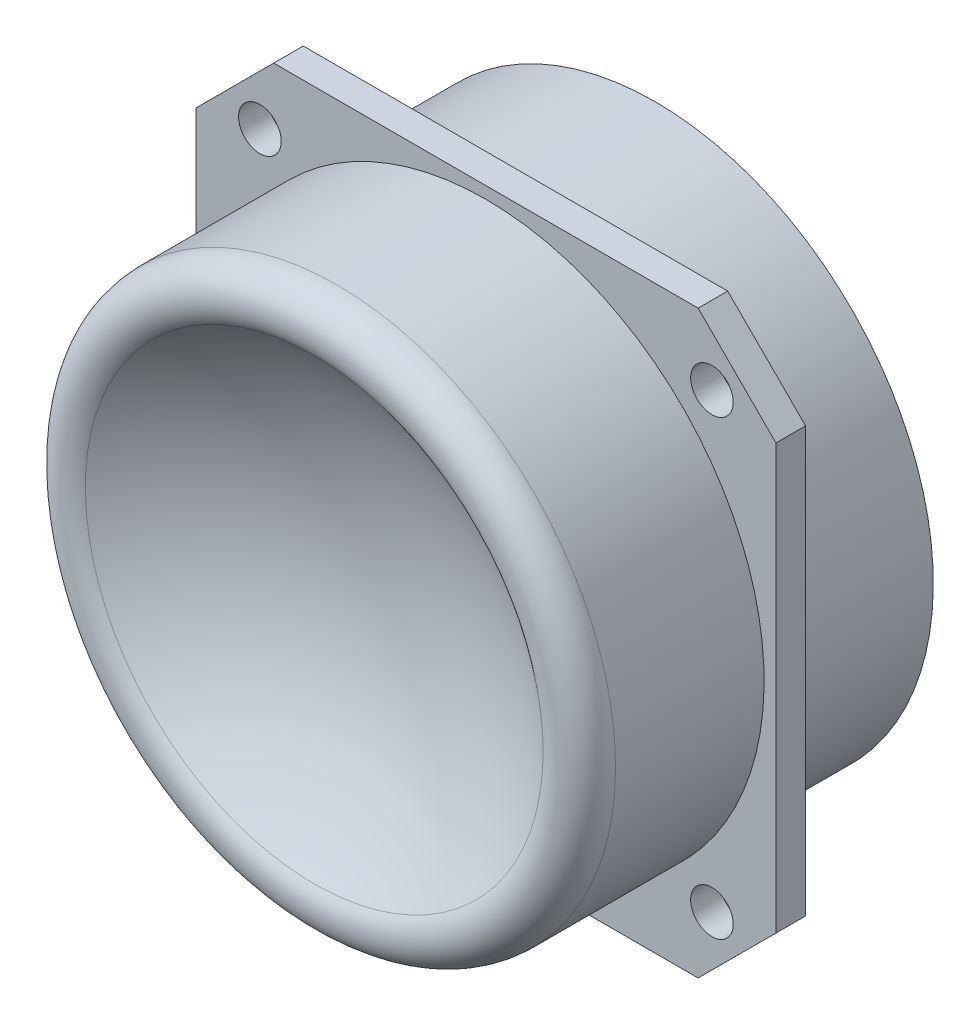
ISO-10303-21;
HEADER;
FILE_DESCRIPTION(('STEP AP214'),'2;1');
FILE_NAME('part.step','',(''),(''),'','','');
FILE_SCHEMA(('AUTOMOTIVE_DESIGN { 1 0 10303 214 1 1 1 1 }'));
ENDSEC;
DATA;
#1=APPLICATION_CONTEXT('core data for automotive mechanical design processes');
#2=APPLICATION_PROTOCOL_DEFINITION('international standard','automotive_design',2000,#1);
#3=PRODUCT_CONTEXT('',#1,'mechanical');
#4=PRODUCT('Part','Part','',(#3));
#5=PRODUCT_RELATED_PRODUCT_CATEGORY('part','',(#4));
#6=PRODUCT_DEFINITION_FORMATION('','',#4);
#7=PRODUCT_DEFINITION_CONTEXT('part definition',#1,'design');
#8=PRODUCT_DEFINITION('design','',#6,#7);
#9=PRODUCT_DEFINITION_SHAPE('','',#8);
#10=(LENGTH_UNIT() NAMED_UNIT(*) SI_UNIT(.MILLI.,.METRE.));
#11=(NAMED_UNIT(*) PLANE_ANGLE_UNIT() SI_UNIT($,.RADIAN.));
#12=(NAMED_UNIT(*) SI_UNIT($,.STERADIAN.) SOLID_ANGLE_UNIT());
#13=UNCERTAINTY_MEASURE_WITH_UNIT(LENGTH_MEASURE(1.E-05),#10,'distance_accuracy_value','');
#14=(GEOMETRIC_REPRESENTATION_CONTEXT(3) GLOBAL_UNCERTAINTY_ASSIGNED_CONTEXT((#13)) GLOBAL_UNIT_ASSIGNED_CONTEXT((#10,
#11,#12)) REPRESENTATION_CONTEXT('',''));
#15=CARTESIAN_POINT('',(0.,0.,0.));
#16=DIRECTION('',(0.,0.,1.));
#17=DIRECTION('',(1.,0.,0.));
#18=AXIS2_PLACEMENT_3D('',#15,#16,#17);
#19=CARTESIAN_POINT('',(24.5,-24.5,-2.5));
#20=DIRECTION('',(1.,0.,0.));
#21=DIRECTION('',(0.,0.,-1.));
#22=AXIS2_PLACEMENT_3D('',#19,#20,#21);
#23=PLANE('',#22);
#24=DIRECTION('',(0.,0.,1.));
#25=VECTOR('',#24,1.);
#26=CARTESIAN_POINT('',(24.5,-17.9264068711928,-2.5));
#27=LINE('',#26,#25);
#28=CARTESIAN_POINT('',(24.5,-17.9264068711928,-2.5));
#29=VERTEX_POINT('',#28);
#30=CARTESIAN_POINT('',(24.5,-17.9264068711928,0.));
#31=VERTEX_POINT('',#30);
#32=EDGE_CURVE('E157',#29,#31,#27,.T.);
#33=ORIENTED_EDGE('',*,*,#32,.F.);
#34=DIRECTION('',(0.,1.,0.));
#35=VECTOR('',#34,1.);
#36=CARTESIAN_POINT('',(24.5,-24.5,-2.5));
#37=LINE('',#36,#35);
#38=CARTESIAN_POINT('',(24.5,17.9264068711928,-2.5));
#39=VERTEX_POINT('',#38);
#40=EDGE_CURVE('E127',#29,#39,#37,.T.);
#41=ORIENTED_EDGE('',*,*,#40,.T.);
#42=DIRECTION('',(0.,0.,1.));
#43=VECTOR('',#42,1.);
#44=CARTESIAN_POINT('',(24.5,17.9264068711928,-2.5));
#45=LINE('',#44,#43);
#46=CARTESIAN_POINT('',(24.5,17.9264068711928,0.));
#47=VERTEX_POINT('',#46);
#48=EDGE_CURVE('E104',#39,#47,#45,.T.);
#49=ORIENTED_EDGE('',*,*,#48,.T.);
#50=DIRECTION('',(0.,1.,0.));
#51=VECTOR('',#50,1.);
#52=CARTESIAN_POINT('',(24.5,-24.5,0.));
#53=LINE('',#52,#51);
#54=EDGE_CURVE('E136',#31,#47,#53,.T.);
#55=ORIENTED_EDGE('',*,*,#54,.F.);
#56=EDGE_LOOP('',(#33,#41,#49,#55));
#57=FACE_BOUND('',#56,.T.);
#58=ADVANCED_FACE('F33',(#57),#23,.T.);
#59=CARTESIAN_POINT('',(-24.5,-24.5,-2.5));
#60=DIRECTION('',(0.,-1.,0.));
#61=DIRECTION('',(0.,0.,-1.));
#62=AXIS2_PLACEMENT_3D('',#59,#60,#61);
#63=PLANE('',#62);
#64=DIRECTION('',(0.,0.,1.));
#65=VECTOR('',#64,1.);
#66=CARTESIAN_POINT('',(-17.9264068711928,-24.5,-2.5));
#67=LINE('',#66,#65);
#68=CARTESIAN_POINT('',(-17.9264068711928,-24.5,-2.5));
#69=VERTEX_POINT('',#68);
#70=CARTESIAN_POINT('',(-17.9264068711928,-24.5,0.));
#71=VERTEX_POINT('',#70);
#72=EDGE_CURVE('E49',#69,#71,#67,.T.);
#73=ORIENTED_EDGE('',*,*,#72,.F.);
#74=DIRECTION('',(1.,0.,0.));
#75=VECTOR('',#74,1.);
#76=CARTESIAN_POINT('',(-24.5,-24.5,-2.5));
#77=LINE('',#76,#75);
#78=CARTESIAN_POINT('',(17.9264068711928,-24.5,-2.5));
#79=VERTEX_POINT('',#78);
#80=EDGE_CURVE('E41',#69,#79,#77,.T.);
#81=ORIENTED_EDGE('',*,*,#80,.T.);
#82=DIRECTION('',(0.,0.,1.));
#83=VECTOR('',#82,1.);
#84=CARTESIAN_POINT('',(17.9264068711928,-24.5,-2.5));
#85=LINE('',#84,#83);
#86=CARTESIAN_POINT('',(17.9264068711928,-24.5,0.));
#87=VERTEX_POINT('',#86);
#88=EDGE_CURVE('E154',#79,#87,#85,.T.);
#89=ORIENTED_EDGE('',*,*,#88,.T.);
#90=DIRECTION('',(1.,0.,0.));
#91=VECTOR('',#90,1.);
#92=CARTESIAN_POINT('',(-24.5,-24.5,0.));
#93=LINE('',#92,#91);
#94=EDGE_CURVE('E131',#71,#87,#93,.T.);
#95=ORIENTED_EDGE('',*,*,#94,.F.);
#96=EDGE_LOOP('',(#73,#81,#89,#95));
#97=FACE_BOUND('',#96,.T.);
#98=ADVANCED_FACE('F152',(#97),#63,.T.);
#99=CARTESIAN_POINT('',(-24.5,-24.5,-2.5));
#100=DIRECTION('',(-1.,0.,0.));
#101=DIRECTION('',(0.,0.,1.));
#102=AXIS2_PLACEMENT_3D('',#99,#100,#101);
#103=PLANE('',#102);
#104=DIRECTION('',(0.,0.,1.));
#105=VECTOR('',#104,1.);
#106=CARTESIAN_POINT('',(-24.5,-17.9264068711928,-2.5));
#107=LINE('',#106,#105);
#108=CARTESIAN_POINT('',(-24.5,-17.9264068711928,-2.5));
#109=VERTEX_POINT('',#108);
#110=CARTESIAN_POINT('',(-24.5,-17.9264068711928,0.));
#111=VERTEX_POINT('',#110);
#112=EDGE_CURVE('E167',#109,#111,#107,.T.);
#113=ORIENTED_EDGE('',*,*,#112,.T.);
#114=DIRECTION('',(0.,-1.,0.));
#115=VECTOR('',#114,1.);
#116=CARTESIAN_POINT('',(-24.5,-24.5,0.));
#117=LINE('',#116,#115);
#118=CARTESIAN_POINT('',(-24.5,17.9264068711929,0.));
#119=VERTEX_POINT('',#118);
#120=EDGE_CURVE('E140',#119,#111,#117,.T.);
#121=ORIENTED_EDGE('',*,*,#120,.F.);
#122=DIRECTION('',(0.,0.,1.));
#123=VECTOR('',#122,1.);
#124=CARTESIAN_POINT('',(-24.5,17.9264068711929,-2.5));
#125=LINE('',#124,#123);
#126=CARTESIAN_POINT('',(-24.5,17.9264068711929,-2.5));
#127=VERTEX_POINT('',#126);
#128=EDGE_CURVE('E57',#127,#119,#125,.T.);
#129=ORIENTED_EDGE('',*,*,#128,.F.);
#130=DIRECTION('',(0.,-1.,0.));
#131=VECTOR('',#130,1.);
#132=CARTESIAN_POINT('',(-24.5,-24.5,-2.5));
#133=LINE('',#132,#131);
#134=EDGE_CURVE('E126',#127,#109,#133,.T.);
#135=ORIENTED_EDGE('',*,*,#134,.T.);
#136=EDGE_LOOP('',(#113,#121,#129,#135));
#137=FACE_BOUND('',#136,.T.);
#138=ADVANCED_FACE('F215',(#137),#103,.T.);
#139=CARTESIAN_POINT('',(-24.5,24.5,-2.5));
#140=DIRECTION('',(0.,1.,0.));
#141=DIRECTION('',(0.,0.,1.));
#142=AXIS2_PLACEMENT_3D('',#139,#140,#141);
#143=PLANE('',#142);
#144=DIRECTION('',(0.,0.,1.));
#145=VECTOR('',#144,1.);
#146=CARTESIAN_POINT('',(17.9264068711928,24.5,-2.5));
#147=LINE('',#146,#145);
#148=CARTESIAN_POINT('',(17.9264068711928,24.5,-2.5));
#149=VERTEX_POINT('',#148);
#150=CARTESIAN_POINT('',(17.9264068711928,24.5,0.));
#151=VERTEX_POINT('',#150);
#152=EDGE_CURVE('E101',#149,#151,#147,.T.);
#153=ORIENTED_EDGE('',*,*,#152,.F.);
#154=DIRECTION('',(-1.,0.,0.));
#155=VECTOR('',#154,1.);
#156=CARTESIAN_POINT('',(-24.5,24.5,-2.5));
#157=LINE('',#156,#155);
#158=CARTESIAN_POINT('',(-17.9264068711928,24.5,-2.5));
#159=VERTEX_POINT('',#158);
#160=EDGE_CURVE('E116',#149,#159,#157,.T.);
#161=ORIENTED_EDGE('',*,*,#160,.T.);
#162=DIRECTION('',(0.,0.,1.));
#163=VECTOR('',#162,1.);
#164=CARTESIAN_POINT('',(-17.9264068711928,24.5,-2.5));
#165=LINE('',#164,#163);
#166=CARTESIAN_POINT('',(-17.9264068711928,24.5,0.));
#167=VERTEX_POINT('',#166);
#168=EDGE_CURVE('E176',#159,#167,#165,.T.);
#169=ORIENTED_EDGE('',*,*,#168,.T.);
#170=DIRECTION('',(-1.,0.,0.));
#171=VECTOR('',#170,1.);
#172=CARTESIAN_POINT('',(-24.5,24.5,0.));
#173=LINE('',#172,#171);
#174=EDGE_CURVE('E118',#151,#167,#173,.T.);
#175=ORIENTED_EDGE('',*,*,#174,.F.);
#176=EDGE_LOOP('',(#153,#161,#169,#175));
#177=FACE_BOUND('',#176,.T.);
#178=ADVANCED_FACE('F114',(#177),#143,.T.);
#179=CARTESIAN_POINT('',(0.,0.,-2.5));
#180=DIRECTION('',(0.,0.,-1.));
#181=DIRECTION('',(-1.,0.,0.));
#182=AXIS2_PLACEMENT_3D('',#179,#180,#181);
#183=PLANE('',#182);
#184=CARTESIAN_POINT('',(-19.0918830920368,19.0918830920368,-2.5));
#185=DIRECTION('',(0.,0.,-1.));
#186=DIRECTION('',(-1.,0.,0.));
#187=AXIS2_PLACEMENT_3D('',#184,#185,#186);
#188=CIRCLE('',#187,1.8);
#189=CARTESIAN_POINT('',(-20.8918830920368,19.0918830920368,-2.5));
#190=VERTEX_POINT('',#189);
#191=EDGE_CURVE('E237',#190,#190,#188,.T.);
#192=ORIENTED_EDGE('',*,*,#191,.F.);
#193=EDGE_LOOP('',(#192));
#194=FACE_BOUND('',#193,.T.);
#195=CARTESIAN_POINT('',(19.0918830920368,-19.0918830920368,-2.5));
#196=DIRECTION('',(0.,0.,-1.));
#197=DIRECTION('',(-1.,0.,0.));
#198=AXIS2_PLACEMENT_3D('',#195,#196,#197);
#199=CIRCLE('',#198,1.8);
#200=CARTESIAN_POINT('',(17.2918830920368,-19.0918830920368,-2.5));
#201=VERTEX_POINT('',#200);
#202=EDGE_CURVE('E231',#201,#201,#199,.T.);
#203=ORIENTED_EDGE('',*,*,#202,.F.);
#204=EDGE_LOOP('',(#203));
#205=FACE_BOUND('',#204,.T.);
#206=CARTESIAN_POINT('',(-19.0918830920368,-19.0918830920368,-2.5));
#207=DIRECTION('',(0.,0.,-1.));
#208=DIRECTION('',(-1.,0.,0.));
#209=AXIS2_PLACEMENT_3D('',#206,#207,#208);
#210=CIRCLE('',#209,1.8);
#211=CARTESIAN_POINT('',(-20.8918830920368,-19.0918830920368,-2.5));
#212=VERTEX_POINT('',#211);
#213=EDGE_CURVE('E225',#212,#212,#210,.T.);
#214=ORIENTED_EDGE('',*,*,#213,.F.);
#215=EDGE_LOOP('',(#214));
#216=FACE_BOUND('',#215,.T.);
#217=CARTESIAN_POINT('',(19.0918830920368,19.0918830920368,-2.5));
#218=DIRECTION('',(0.,0.,-1.));
#219=DIRECTION('',(-1.,0.,0.));
#220=AXIS2_PLACEMENT_3D('',#217,#218,#219);
#221=CIRCLE('',#220,1.8);
#222=CARTESIAN_POINT('',(17.2918830920368,19.0918830920368,-2.5));
#223=VERTEX_POINT('',#222);
#224=EDGE_CURVE('E169',#223,#223,#221,.T.);
#225=ORIENTED_EDGE('',*,*,#224,.F.);
#226=EDGE_LOOP('',(#225));
#227=FACE_BOUND('',#226,.T.);
#228=DIRECTION('',(-0.707106781186547,0.707106781186548,0.));
#229=VECTOR('',#228,1.);
#230=CARTESIAN_POINT('',(-24.5,-17.9264068711928,-2.5));
#231=LINE('',#230,#229);
#232=EDGE_CURVE('E165',#69,#109,#231,.T.);
#233=ORIENTED_EDGE('',*,*,#232,.T.);
#234=ORIENTED_EDGE('',*,*,#134,.F.);
#235=DIRECTION('',(0.707106781186548,0.707106781186547,0.));
#236=VECTOR('',#235,1.);
#237=CARTESIAN_POINT('',(-24.5,17.9264068711929,-2.5));
#238=LINE('',#237,#236);
#239=EDGE_CURVE('E125',#127,#159,#238,.T.);
#240=ORIENTED_EDGE('',*,*,#239,.T.);
#241=ORIENTED_EDGE('',*,*,#160,.F.);
#242=DIRECTION('',(0.707106781186548,-0.707106781186548,0.));
#243=VECTOR('',#242,1.);
#244=CARTESIAN_POINT('',(24.5,17.9264068711928,-2.5));
#245=LINE('',#244,#243);
#246=EDGE_CURVE('E98',#149,#39,#245,.T.);
#247=ORIENTED_EDGE('',*,*,#246,.T.);
#248=ORIENTED_EDGE('',*,*,#40,.F.);
#249=DIRECTION('',(-0.707106781186547,-0.707106781186548,0.));
#250=VECTOR('',#249,1.);
#251=CARTESIAN_POINT('',(24.5,-17.9264068711928,-2.5));
#252=LINE('',#251,#250);
#253=EDGE_CURVE('E160',#29,#79,#252,.T.);
#254=ORIENTED_EDGE('',*,*,#253,.T.);
#255=ORIENTED_EDGE('',*,*,#80,.F.);
#256=EDGE_LOOP('',(#233,#234,#240,#241,#247,#248,#254,#255));
#257=FACE_BOUND('',#256,.T.);
#258=CARTESIAN_POINT('',(0.,0.,-2.5));
#259=DIRECTION('',(0.,0.,-1.));
#260=DIRECTION('',(-1.,0.,0.));
#261=AXIS2_PLACEMENT_3D('',#258,#259,#260);
#262=CIRCLE('',#261,23.5);
#263=CARTESIAN_POINT('',(-23.5,0.,-2.5));
#264=VERTEX_POINT('',#263);
#265=EDGE_CURVE('E11',#264,#264,#262,.T.);
#266=ORIENTED_EDGE('',*,*,#265,.F.);
#267=EDGE_LOOP('',(#266));
#268=FACE_BOUND('',#267,.T.);
#269=ADVANCED_FACE('F122',(#194,#205,#216,#227,#257,#268),#183,.T.);
#270=CARTESIAN_POINT('',(0.,0.,0.));
#271=DIRECTION('',(0.,0.,-1.));
#272=DIRECTION('',(-1.,0.,0.));
#273=AXIS2_PLACEMENT_3D('',#270,#271,#272);
#274=PLANE('',#273);
#275=CARTESIAN_POINT('',(-19.0918830920368,19.0918830920368,0.));
#276=DIRECTION('',(0.,0.,1.));
#277=DIRECTION('',(1.,0.,0.));
#278=AXIS2_PLACEMENT_3D('',#275,#276,#277);
#279=CIRCLE('',#278,1.8);
#280=CARTESIAN_POINT('',(-17.2918830920368,19.0918830920368,0.));
#281=VERTEX_POINT('',#280);
#282=EDGE_CURVE('E240',#281,#281,#279,.T.);
#283=ORIENTED_EDGE('',*,*,#282,.F.);
#284=EDGE_LOOP('',(#283));
#285=FACE_BOUND('',#284,.T.);
#286=CARTESIAN_POINT('',(19.0918830920368,-19.0918830920368,0.));
#287=DIRECTION('',(0.,0.,1.));
#288=DIRECTION('',(1.,0.,0.));
#289=AXIS2_PLACEMENT_3D('',#286,#287,#288);
#290=CIRCLE('',#289,1.8);
#291=CARTESIAN_POINT('',(20.8918830920368,-19.0918830920368,0.));
#292=VERTEX_POINT('',#291);
#293=EDGE_CURVE('E234',#292,#292,#290,.T.);
#294=ORIENTED_EDGE('',*,*,#293,.F.);
#295=EDGE_LOOP('',(#294));
#296=FACE_BOUND('',#295,.T.);
#297=CARTESIAN_POINT('',(-19.0918830920368,-19.0918830920368,0.));
#298=DIRECTION('',(0.,0.,1.));
#299=DIRECTION('',(1.,0.,0.));
#300=AXIS2_PLACEMENT_3D('',#297,#298,#299);
#301=CIRCLE('',#300,1.8);
#302=CARTESIAN_POINT('',(-17.2918830920368,-19.0918830920368,0.));
#303=VERTEX_POINT('',#302);
#304=EDGE_CURVE('E228',#303,#303,#301,.T.);
#305=ORIENTED_EDGE('',*,*,#304,.F.);
#306=EDGE_LOOP('',(#305));
#307=FACE_BOUND('',#306,.T.);
#308=CARTESIAN_POINT('',(19.0918830920368,19.0918830920368,0.));
#309=DIRECTION('',(0.,0.,1.));
#310=DIRECTION('',(1.,0.,0.));
#311=AXIS2_PLACEMENT_3D('',#308,#309,#310);
#312=CIRCLE('',#311,1.8);
#313=CARTESIAN_POINT('',(20.8918830920368,19.0918830920368,0.));
#314=VERTEX_POINT('',#313);
#315=EDGE_CURVE('E222',#314,#314,#312,.T.);
#316=ORIENTED_EDGE('',*,*,#315,.F.);
#317=EDGE_LOOP('',(#316));
#318=FACE_BOUND('',#317,.T.);
#319=CARTESIAN_POINT('',(0.,0.,0.));
#320=DIRECTION('',(0.,0.,-1.));
#321=DIRECTION('',(-1.,0.,0.));
#322=AXIS2_PLACEMENT_3D('',#319,#320,#321);
#323=CIRCLE('',#322,23.5);
#324=CARTESIAN_POINT('',(-23.5,0.,0.));
#325=VERTEX_POINT('',#324);
#326=EDGE_CURVE('E36',#325,#325,#323,.T.);
#327=ORIENTED_EDGE('',*,*,#326,.T.);
#328=EDGE_LOOP('',(#327));
#329=FACE_BOUND('',#328,.T.);
#330=ORIENTED_EDGE('',*,*,#120,.T.);
#331=DIRECTION('',(-0.707106781186547,0.707106781186548,0.));
#332=VECTOR('',#331,1.);
#333=CARTESIAN_POINT('',(-24.5,-17.9264068711928,0.));
#334=LINE('',#333,#332);
#335=EDGE_CURVE('E149',#71,#111,#334,.T.);
#336=ORIENTED_EDGE('',*,*,#335,.F.);
#337=ORIENTED_EDGE('',*,*,#94,.T.);
#338=DIRECTION('',(-0.707106781186547,-0.707106781186548,0.));
#339=VECTOR('',#338,1.);
#340=CARTESIAN_POINT('',(24.5,-17.9264068711928,0.));
#341=LINE('',#340,#339);
#342=EDGE_CURVE('E147',#31,#87,#341,.T.);
#343=ORIENTED_EDGE('',*,*,#342,.F.);
#344=ORIENTED_EDGE('',*,*,#54,.T.);
#345=DIRECTION('',(0.707106781186548,-0.707106781186548,0.));
#346=VECTOR('',#345,1.);
#347=CARTESIAN_POINT('',(24.5,17.9264068711928,0.));
#348=LINE('',#347,#346);
#349=EDGE_CURVE('E109',#151,#47,#348,.T.);
#350=ORIENTED_EDGE('',*,*,#349,.F.);
#351=ORIENTED_EDGE('',*,*,#174,.T.);
#352=DIRECTION('',(0.707106781186548,0.707106781186547,0.));
#353=VECTOR('',#352,1.);
#354=CARTESIAN_POINT('',(-24.5,17.9264068711929,0.));
#355=LINE('',#354,#353);
#356=EDGE_CURVE('E174',#119,#167,#355,.T.);
#357=ORIENTED_EDGE('',*,*,#356,.F.);
#358=EDGE_LOOP('',(#330,#336,#337,#343,#344,#350,#351,#357));
#359=FACE_BOUND('',#358,.T.);
#360=ADVANCED_FACE('F146',(#285,#296,#307,#318,#329,#359),#274,.F.);
#361=CARTESIAN_POINT('',(0.,0.,12.55));
#362=DIRECTION('',(0.,0.,-1.));
#363=DIRECTION('',(0.,1.,0.));
#364=AXIS2_PLACEMENT_3D('',#361,#362,#363);
#365=TOROIDAL_SURFACE('',#364,20.96,2.54);
#366=CARTESIAN_POINT('',(0.,0.,14.5012579938626));
#367=DIRECTION('',(0.,0.,-1.));
#368=DIRECTION('',(0.,1.,0.));
#369=AXIS2_PLACEMENT_3D('',#366,#367,#368);
#370=CIRCLE('',#369,19.3339027577087);
#371=CARTESIAN_POINT('',(0.,19.3339027577087,14.5012579938626));
#372=VERTEX_POINT('',#371);
#373=EDGE_CURVE('E185',#372,#372,#370,.T.);
#374=ORIENTED_EDGE('',*,*,#373,.T.);
#375=EDGE_LOOP('',(#374));
#376=FACE_BOUND('',#375,.T.);
#377=CARTESIAN_POINT('',(0.,0.,12.55));
#378=DIRECTION('',(0.,0.,-1.));
#379=DIRECTION('',(0.,1.,0.));
#380=AXIS2_PLACEMENT_3D('',#377,#378,#379);
#381=CIRCLE('',#380,23.5);
#382=CARTESIAN_POINT('',(0.,23.5,12.55));
#383=VERTEX_POINT('',#382);
#384=EDGE_CURVE('E182',#383,#383,#381,.T.);
#385=ORIENTED_EDGE('',*,*,#384,.F.);
#386=EDGE_LOOP('',(#385));
#387=FACE_BOUND('',#386,.T.);
#388=ADVANCED_FACE('F205',(#376,#387),#365,.T.);
#389=CARTESIAN_POINT('',(0.,0.,37.7012434113294));
#390=DIRECTION('',(0.,0.,-1.));
#391=DIRECTION('',(0.,1.,0.));
#392=AXIS2_PLACEMENT_3D('',#389,#390,#391);
#393=SPHERICAL_SURFACE('',#392,30.1999854174668);
#394=ORIENTED_EDGE('',*,*,#373,.F.);
#395=EDGE_LOOP('',(#394));
#396=FACE_BOUND('',#395,.T.);
#397=ADVANCED_FACE('F196',(#396),#393,.F.);
#398=CARTESIAN_POINT('',(0.,0.,0.));
#399=DIRECTION('',(0.,0.,-1.));
#400=DIRECTION('',(0.,1.,0.));
#401=AXIS2_PLACEMENT_3D('',#398,#399,#400);
#402=CYLINDRICAL_SURFACE('',#401,23.5);
#403=ORIENTED_EDGE('',*,*,#384,.T.);
#404=EDGE_LOOP('',(#403));
#405=FACE_BOUND('',#404,.T.);
#406=ORIENTED_EDGE('',*,*,#326,.F.);
#407=EDGE_LOOP('',(#406));
#408=FACE_BOUND('',#407,.T.);
#409=ADVANCED_FACE('F193',(#405,#408),#402,.T.);
#410=ORIENTED_EDGE('',*,*,#265,.T.);
#411=EDGE_LOOP('',(#410));
#412=FACE_BOUND('',#411,.T.);
#413=CARTESIAN_POINT('',(0.,0.,-14.29));
#414=DIRECTION('',(0.,0.,-1.));
#415=DIRECTION('',(0.,1.,0.));
#416=AXIS2_PLACEMENT_3D('',#413,#414,#415);
#417=CIRCLE('',#416,23.5);
#418=CARTESIAN_POINT('',(0.,23.5,-14.29));
#419=VERTEX_POINT('',#418);
#420=EDGE_CURVE('E178',#419,#419,#417,.T.);
#421=ORIENTED_EDGE('',*,*,#420,.F.);
#422=EDGE_LOOP('',(#421));
#423=FACE_BOUND('',#422,.T.);
#424=ADVANCED_FACE('F195',(#412,#423),#402,.T.);
#425=CARTESIAN_POINT('',(0.,0.,-14.29));
#426=DIRECTION('',(0.,0.,-1.));
#427=DIRECTION('',(0.,1.,0.));
#428=AXIS2_PLACEMENT_3D('',#425,#426,#427);
#429=PLANE('',#428);
#430=ORIENTED_EDGE('',*,*,#420,.T.);
#431=EDGE_LOOP('',(#430));
#432=FACE_BOUND('',#431,.T.);
#433=ADVANCED_FACE('F203',(#432),#429,.T.);
#434=CARTESIAN_POINT('',(-24.5,17.9264068711929,-2.5));
#435=DIRECTION('',(0.707106781186547,-0.707106781186548,0.));
#436=DIRECTION('',(0.707106781186548,0.707106781186547,0.));
#437=AXIS2_PLACEMENT_3D('',#434,#435,#436);
#438=PLANE('',#437);
#439=ORIENTED_EDGE('',*,*,#356,.T.);
#440=ORIENTED_EDGE('',*,*,#168,.F.);
#441=ORIENTED_EDGE('',*,*,#239,.F.);
#442=ORIENTED_EDGE('',*,*,#128,.T.);
#443=EDGE_LOOP('',(#439,#440,#441,#442));
#444=FACE_BOUND('',#443,.T.);
#445=ADVANCED_FACE('F274',(#444),#438,.F.);
#446=CARTESIAN_POINT('',(24.5,17.9264068711928,-2.5));
#447=DIRECTION('',(-0.707106781186548,-0.707106781186548,0.));
#448=DIRECTION('',(0.707106781186548,-0.707106781186548,0.));
#449=AXIS2_PLACEMENT_3D('',#446,#447,#448);
#450=PLANE('',#449);
#451=ORIENTED_EDGE('',*,*,#349,.T.);
#452=ORIENTED_EDGE('',*,*,#48,.F.);
#453=ORIENTED_EDGE('',*,*,#246,.F.);
#454=ORIENTED_EDGE('',*,*,#152,.T.);
#455=EDGE_LOOP('',(#451,#452,#453,#454));
#456=FACE_BOUND('',#455,.T.);
#457=ADVANCED_FACE('F100',(#456),#450,.F.);
#458=CARTESIAN_POINT('',(24.5,-17.9264068711928,-2.5));
#459=DIRECTION('',(-0.707106781186548,0.707106781186547,0.));
#460=DIRECTION('',(-0.707106781186547,-0.707106781186548,0.));
#461=AXIS2_PLACEMENT_3D('',#458,#459,#460);
#462=PLANE('',#461);
#463=ORIENTED_EDGE('',*,*,#342,.T.);
#464=ORIENTED_EDGE('',*,*,#88,.F.);
#465=ORIENTED_EDGE('',*,*,#253,.F.);
#466=ORIENTED_EDGE('',*,*,#32,.T.);
#467=EDGE_LOOP('',(#463,#464,#465,#466));
#468=FACE_BOUND('',#467,.T.);
#469=ADVANCED_FACE('F268',(#468),#462,.F.);
#470=CARTESIAN_POINT('',(-24.5,-17.9264068711928,-2.5));
#471=DIRECTION('',(0.707106781186548,0.707106781186547,0.));
#472=DIRECTION('',(-0.707106781186547,0.707106781186548,0.));
#473=AXIS2_PLACEMENT_3D('',#470,#471,#472);
#474=PLANE('',#473);
#475=ORIENTED_EDGE('',*,*,#335,.T.);
#476=ORIENTED_EDGE('',*,*,#112,.F.);
#477=ORIENTED_EDGE('',*,*,#232,.F.);
#478=ORIENTED_EDGE('',*,*,#72,.T.);
#479=EDGE_LOOP('',(#475,#476,#477,#478));
#480=FACE_BOUND('',#479,.T.);
#481=ADVANCED_FACE('F258',(#480),#474,.F.);
#482=CARTESIAN_POINT('',(19.0918830920368,19.0918830920368,0.));
#483=DIRECTION('',(0.,0.,1.));
#484=DIRECTION('',(1.,0.,0.));
#485=AXIS2_PLACEMENT_3D('',#482,#483,#484);
#486=CYLINDRICAL_SURFACE('',#485,1.8);
#487=ORIENTED_EDGE('',*,*,#224,.T.);
#488=EDGE_LOOP('',(#487));
#489=FACE_BOUND('',#488,.T.);
#490=ORIENTED_EDGE('',*,*,#315,.T.);
#491=EDGE_LOOP('',(#490));
#492=FACE_BOUND('',#491,.T.);
#493=ADVANCED_FACE('F255',(#489,#492),#486,.F.);
#494=CARTESIAN_POINT('',(-19.0918830920368,-19.0918830920368,0.));
#495=DIRECTION('',(0.,0.,1.));
#496=DIRECTION('',(1.,0.,0.));
#497=AXIS2_PLACEMENT_3D('',#494,#495,#496);
#498=CYLINDRICAL_SURFACE('',#497,1.8);
#499=ORIENTED_EDGE('',*,*,#213,.T.);
#500=EDGE_LOOP('',(#499));
#501=FACE_BOUND('',#500,.T.);
#502=ORIENTED_EDGE('',*,*,#304,.T.);
#503=EDGE_LOOP('',(#502));
#504=FACE_BOUND('',#503,.T.);
#505=ADVANCED_FACE('F257',(#501,#504),#498,.F.);
#506=CARTESIAN_POINT('',(19.0918830920368,-19.0918830920368,0.));
#507=DIRECTION('',(0.,0.,1.));
#508=DIRECTION('',(1.,0.,0.));
#509=AXIS2_PLACEMENT_3D('',#506,#507,#508);
#510=CYLINDRICAL_SURFACE('',#509,1.8);
#511=ORIENTED_EDGE('',*,*,#202,.T.);
#512=EDGE_LOOP('',(#511));
#513=FACE_BOUND('',#512,.T.);
#514=ORIENTED_EDGE('',*,*,#293,.T.);
#515=EDGE_LOOP('',(#514));
#516=FACE_BOUND('',#515,.T.);
#517=ADVANCED_FACE('F265',(#513,#516),#510,.F.);
#518=CARTESIAN_POINT('',(-19.0918830920368,19.0918830920368,0.));
#519=DIRECTION('',(0.,0.,1.));
#520=DIRECTION('',(1.,0.,0.));
#521=AXIS2_PLACEMENT_3D('',#518,#519,#520);
#522=CYLINDRICAL_SURFACE('',#521,1.8);
#523=ORIENTED_EDGE('',*,*,#191,.T.);
#524=EDGE_LOOP('',(#523));
#525=FACE_BOUND('',#524,.T.);
#526=ORIENTED_EDGE('',*,*,#282,.T.);
#527=EDGE_LOOP('',(#526));
#528=FACE_BOUND('',#527,.T.);
#529=ADVANCED_FACE('F244',(#525,#528),#522,.F.);
#530=CLOSED_SHELL('',(#58,#98,#138,#178,#269,#360,#388,#397,#409,#424,#433,#445,#457,#469,#481,
#493,#505,#517,#529));
#531=MANIFOLD_SOLID_BREP('B2',#530);
#532=ADVANCED_BREP_SHAPE_REPRESENTATION('',(#18,#531),#14);
#533=SHAPE_DEFINITION_REPRESENTATION(#9,#532);
ENDSEC;
END-ISO-10303-21;
